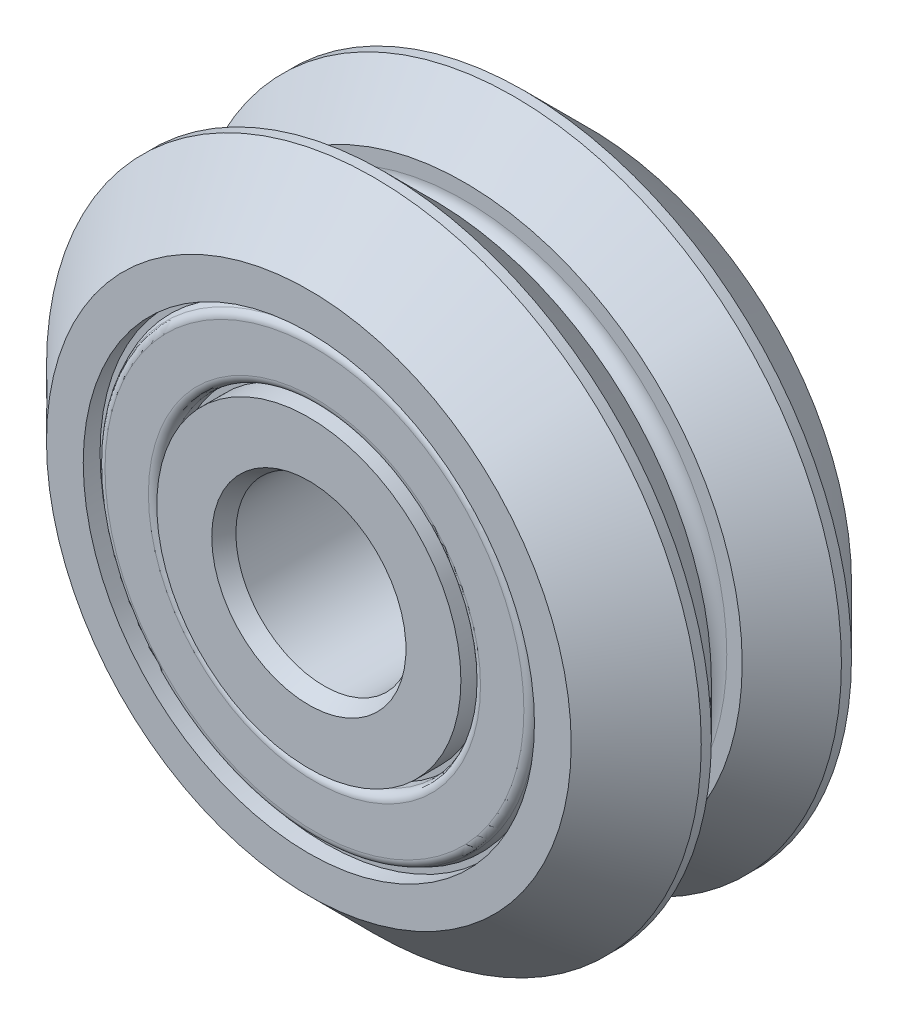
ISO-10303-21;
HEADER;
FILE_DESCRIPTION(('STEP AP214'),'2;1');
FILE_NAME('part.step','',(''),(''),'','','');
FILE_SCHEMA(('AUTOMOTIVE_DESIGN { 1 0 10303 214 1 1 1 1 }'));
ENDSEC;
DATA;
#1=APPLICATION_CONTEXT('core data for automotive mechanical design processes');
#2=APPLICATION_PROTOCOL_DEFINITION('international standard','automotive_design',2000,#1);
#3=PRODUCT_CONTEXT('',#1,'mechanical');
#4=PRODUCT('Part','Part','',(#3));
#5=PRODUCT_RELATED_PRODUCT_CATEGORY('part','',(#4));
#6=PRODUCT_DEFINITION_FORMATION('','',#4);
#7=PRODUCT_DEFINITION_CONTEXT('part definition',#1,'design');
#8=PRODUCT_DEFINITION('design','',#6,#7);
#9=PRODUCT_DEFINITION_SHAPE('','',#8);
#10=(LENGTH_UNIT() NAMED_UNIT(*) SI_UNIT(.MILLI.,.METRE.));
#11=(NAMED_UNIT(*) PLANE_ANGLE_UNIT() SI_UNIT($,.RADIAN.));
#12=(NAMED_UNIT(*) SI_UNIT($,.STERADIAN.) SOLID_ANGLE_UNIT());
#13=UNCERTAINTY_MEASURE_WITH_UNIT(LENGTH_MEASURE(1.E-05),#10,'distance_accuracy_value','');
#14=(GEOMETRIC_REPRESENTATION_CONTEXT(3) GLOBAL_UNCERTAINTY_ASSIGNED_CONTEXT((#13)) GLOBAL_UNIT_ASSIGNED_CONTEXT((#10,
#11,#12)) REPRESENTATION_CONTEXT('',''));
#15=CARTESIAN_POINT('',(0.,0.,0.));
#16=DIRECTION('',(0.,0.,1.));
#17=DIRECTION('',(1.,0.,0.));
#18=AXIS2_PLACEMENT_3D('',#15,#16,#17);
#19=CARTESIAN_POINT('',(0.,5.11118769230769,-2.60350000000001));
#20=DIRECTION('',(0.,0.,-1.));
#21=DIRECTION('',(1.,0.,0.));
#22=AXIS2_PLACEMENT_3D('',#19,#20,#21);
#23=PLANE('',#22);
#24=CARTESIAN_POINT('',(0.,0.,-2.60350000000001));
#25=DIRECTION('',(0.,0.,1.));
#26=DIRECTION('',(1.,0.,0.));
#27=AXIS2_PLACEMENT_3D('',#24,#25,#26);
#28=CIRCLE('',#27,5.11118769230769);
#29=CARTESIAN_POINT('',(5.11118769230769,0.,-2.60350000000001));
#30=VERTEX_POINT('',#29);
#31=EDGE_CURVE('E61',#30,#30,#28,.T.);
#32=ORIENTED_EDGE('',*,*,#31,.T.);
#33=EDGE_LOOP('',(#32));
#34=FACE_BOUND('',#33,.T.);
#35=CARTESIAN_POINT('',(0.,0.,-2.60350000000001));
#36=DIRECTION('',(0.,0.,1.));
#37=DIRECTION('',(1.,0.,0.));
#38=AXIS2_PLACEMENT_3D('',#35,#36,#37);
#39=CIRCLE('',#38,3.57148);
#40=CARTESIAN_POINT('',(3.57148,0.,-2.60350000000001));
#41=VERTEX_POINT('',#40);
#42=EDGE_CURVE('E70',#41,#41,#39,.T.);
#43=ORIENTED_EDGE('',*,*,#42,.F.);
#44=EDGE_LOOP('',(#43));
#45=FACE_BOUND('',#44,.T.);
#46=ADVANCED_FACE('F41',(#34,#45),#23,.F.);
#47=CARTESIAN_POINT('',(0.,0.,-3.175));
#48=DIRECTION('',(0.,0.,-1.));
#49=DIRECTION('',(1.,0.,0.));
#50=AXIS2_PLACEMENT_3D('',#47,#48,#49);
#51=CYLINDRICAL_SURFACE('',#50,5.11118769230769);
#52=CARTESIAN_POINT('',(0.,0.,-2.794));
#53=DIRECTION('',(0.,0.,1.));
#54=DIRECTION('',(1.,0.,0.));
#55=AXIS2_PLACEMENT_3D('',#52,#53,#54);
#56=CIRCLE('',#55,5.11118769230769);
#57=CARTESIAN_POINT('',(5.11118769230769,0.,-2.794));
#58=VERTEX_POINT('',#57);
#59=EDGE_CURVE('E64',#58,#58,#56,.T.);
#60=ORIENTED_EDGE('',*,*,#59,.T.);
#61=EDGE_LOOP('',(#60));
#62=FACE_BOUND('',#61,.T.);
#63=ORIENTED_EDGE('',*,*,#31,.F.);
#64=EDGE_LOOP('',(#63));
#65=FACE_BOUND('',#64,.T.);
#66=ADVANCED_FACE('F77',(#62,#65),#51,.T.);
#67=CARTESIAN_POINT('',(0.,5.11118769230769,-2.794));
#68=DIRECTION('',(0.,0.,1.));
#69=DIRECTION('',(-1.,0.,0.));
#70=AXIS2_PLACEMENT_3D('',#67,#68,#69);
#71=PLANE('',#70);
#72=CARTESIAN_POINT('',(0.,0.,-2.794));
#73=DIRECTION('',(0.,0.,1.));
#74=DIRECTION('',(1.,0.,0.));
#75=AXIS2_PLACEMENT_3D('',#72,#73,#74);
#76=CIRCLE('',#75,4.98418769230769);
#77=CARTESIAN_POINT('',(4.98418769230769,0.,-2.794));
#78=VERTEX_POINT('',#77);
#79=EDGE_CURVE('E67',#78,#78,#76,.T.);
#80=ORIENTED_EDGE('',*,*,#79,.T.);
#81=EDGE_LOOP('',(#80));
#82=FACE_BOUND('',#81,.T.);
#83=ORIENTED_EDGE('',*,*,#59,.F.);
#84=EDGE_LOOP('',(#83));
#85=FACE_BOUND('',#84,.T.);
#86=ADVANCED_FACE('F83',(#82,#85),#71,.F.);
#87=CARTESIAN_POINT('',(0.,0.,-2.794));
#88=DIRECTION('',(0.,0.,1.));
#89=DIRECTION('',(-1.,0.,0.));
#90=AXIS2_PLACEMENT_3D('',#87,#88,#89);
#91=CONICAL_SURFACE('',#90,4.98418769230769,0.436332312998612);
#92=CARTESIAN_POINT('',(0.,0.,-2.93800877886161));
#93=DIRECTION('',(0.,0.,1.));
#94=DIRECTION('',(1.,0.,0.));
#95=AXIS2_PLACEMENT_3D('',#92,#93,#94);
#96=CIRCLE('',#95,4.91703529588297);
#97=CARTESIAN_POINT('',(4.91703529588297,0.,-2.93800877886161));
#98=VERTEX_POINT('',#97);
#99=EDGE_CURVE('E48',#98,#98,#96,.F.);
#100=ORIENTED_EDGE('',*,*,#99,.F.);
#101=EDGE_LOOP('',(#100));
#102=FACE_BOUND('',#101,.T.);
#103=ORIENTED_EDGE('',*,*,#79,.F.);
#104=EDGE_LOOP('',(#103));
#105=FACE_BOUND('',#104,.T.);
#106=ADVANCED_FACE('F102',(#102,#105),#91,.T.);
#107=CARTESIAN_POINT('',(0.,4.86574554713631,-3.048));
#108=DIRECTION('',(0.,0.,1.));
#109=DIRECTION('',(-1.,0.,0.));
#110=AXIS2_PLACEMENT_3D('',#107,#108,#109);
#111=PLANE('',#110);
#112=CARTESIAN_POINT('',(0.,0.,-3.048));
#113=DIRECTION('',(0.,0.,-1.));
#114=DIRECTION('',(-1.,0.,0.));
#115=AXIS2_PLACEMENT_3D('',#112,#113,#114);
#116=CIRCLE('',#115,4.74438366245249);
#117=CARTESIAN_POINT('',(-4.74438366245249,0.,-3.048));
#118=VERTEX_POINT('',#117);
#119=EDGE_CURVE('E52',#118,#118,#116,.F.);
#120=ORIENTED_EDGE('',*,*,#119,.F.);
#121=EDGE_LOOP('',(#120));
#122=FACE_BOUND('',#121,.T.);
#123=CARTESIAN_POINT('',(0.,0.,-3.048));
#124=DIRECTION('',(0.,0.,-1.));
#125=DIRECTION('',(-1.,0.,0.));
#126=AXIS2_PLACEMENT_3D('',#123,#124,#125);
#127=CIRCLE('',#126,3.76198);
#128=CARTESIAN_POINT('',(-3.76198,0.,-3.048));
#129=VERTEX_POINT('',#128);
#130=EDGE_CURVE('E56',#129,#129,#127,.T.);
#131=ORIENTED_EDGE('',*,*,#130,.F.);
#132=EDGE_LOOP('',(#131));
#133=FACE_BOUND('',#132,.T.);
#134=ADVANCED_FACE('F94',(#122,#133),#111,.F.);
#135=CARTESIAN_POINT('',(0.,0.,-3.175));
#136=DIRECTION('',(0.,0.,-1.));
#137=DIRECTION('',(1.,0.,0.));
#138=AXIS2_PLACEMENT_3D('',#135,#136,#137);
#139=CYLINDRICAL_SURFACE('',#138,3.57148);
#140=CARTESIAN_POINT('',(0.,0.,-2.8575));
#141=DIRECTION('',(0.,0.,-1.));
#142=DIRECTION('',(-1.,0.,0.));
#143=AXIS2_PLACEMENT_3D('',#140,#141,#142);
#144=CIRCLE('',#143,3.57148);
#145=CARTESIAN_POINT('',(-3.57148,0.,-2.8575));
#146=VERTEX_POINT('',#145);
#147=EDGE_CURVE('E11',#146,#146,#144,.F.);
#148=ORIENTED_EDGE('',*,*,#147,.F.);
#149=EDGE_LOOP('',(#148));
#150=FACE_BOUND('',#149,.T.);
#151=ORIENTED_EDGE('',*,*,#42,.T.);
#152=EDGE_LOOP('',(#151));
#153=FACE_BOUND('',#152,.T.);
#154=ADVANCED_FACE('F74',(#150,#153),#139,.F.);
#155=CARTESIAN_POINT('',(0.,0.,-2.8575));
#156=DIRECTION('',(0.,0.,1.));
#157=DIRECTION('',(-1.,0.,0.));
#158=AXIS2_PLACEMENT_3D('',#155,#156,#157);
#159=TOROIDAL_SURFACE('',#158,4.74438366245249,0.1905);
#160=ORIENTED_EDGE('',*,*,#99,.T.);
#161=EDGE_LOOP('',(#160));
#162=FACE_BOUND('',#161,.T.);
#163=ORIENTED_EDGE('',*,*,#119,.T.);
#164=EDGE_LOOP('',(#163));
#165=FACE_BOUND('',#164,.T.);
#166=ADVANCED_FACE('F87',(#162,#165),#159,.T.);
#167=CARTESIAN_POINT('',(0.,0.,-2.8575));
#168=DIRECTION('',(0.,0.,1.));
#169=DIRECTION('',(-1.,0.,0.));
#170=AXIS2_PLACEMENT_3D('',#167,#168,#169);
#171=TOROIDAL_SURFACE('',#170,3.76198,0.1905);
#172=ORIENTED_EDGE('',*,*,#130,.T.);
#173=EDGE_LOOP('',(#172));
#174=FACE_BOUND('',#173,.T.);
#175=ORIENTED_EDGE('',*,*,#147,.T.);
#176=EDGE_LOOP('',(#175));
#177=FACE_BOUND('',#176,.T.);
#178=ADVANCED_FACE('F43',(#174,#177),#171,.T.);
#179=CLOSED_SHELL('',(#46,#66,#86,#106,#134,#154,#166,#178));
#180=MANIFOLD_SOLID_BREP('B2',#179);
#181=CARTESIAN_POINT('',(0.,0.,0.));
#182=DIRECTION('',(0.,0.,1.));
#183=DIRECTION('',(1.,0.,0.));
#184=AXIS2_PLACEMENT_3D('',#181,#182,#183);
#185=TOROIDAL_SURFACE('',#184,5.9436,0.349250000000003);
#186=CARTESIAN_POINT('',(0.,0.,0.349249999999998));
#187=DIRECTION('',(0.,0.,1.));
#188=DIRECTION('',(1.,0.,0.));
#189=AXIS2_PLACEMENT_3D('',#186,#187,#188);
#190=CIRCLE('',#189,5.9436);
#191=CARTESIAN_POINT('',(5.9436,0.,0.349249999999998));
#192=VERTEX_POINT('',#191);
#193=EDGE_CURVE('E40',#192,#192,#190,.T.);
#194=ORIENTED_EDGE('',*,*,#193,.F.);
#195=EDGE_LOOP('',(#194));
#196=FACE_BOUND('',#195,.T.);
#197=CARTESIAN_POINT('',(0.,0.,-0.349249999999998));
#198=DIRECTION('',(0.,0.,1.));
#199=DIRECTION('',(1.,0.,0.));
#200=AXIS2_PLACEMENT_3D('',#197,#198,#199);
#201=CIRCLE('',#200,5.9436);
#202=CARTESIAN_POINT('',(5.9436,0.,-0.349249999999998));
#203=VERTEX_POINT('',#202);
#204=EDGE_CURVE('E228',#203,#203,#201,.T.);
#205=ORIENTED_EDGE('',*,*,#204,.T.);
#206=EDGE_LOOP('',(#205));
#207=FACE_BOUND('',#206,.T.);
#208=ADVANCED_FACE('F197',(#196,#207),#185,.F.);
#209=CARTESIAN_POINT('',(0.,5.9436,0.349249999999998));
#210=DIRECTION('',(0.,0.,1.));
#211=DIRECTION('',(1.,0.,0.));
#212=AXIS2_PLACEMENT_3D('',#209,#210,#211);
#213=PLANE('',#212);
#214=CARTESIAN_POINT('',(0.,0.,0.349249999999998));
#215=DIRECTION('',(0.,0.,1.));
#216=DIRECTION('',(1.,0.,0.));
#217=AXIS2_PLACEMENT_3D('',#214,#215,#216);
#218=CIRCLE('',#217,6.29285000000001);
#219=CARTESIAN_POINT('',(6.29285000000001,0.,0.349249999999998));
#220=VERTEX_POINT('',#219);
#221=EDGE_CURVE('E203',#220,#220,#218,.T.);
#222=ORIENTED_EDGE('',*,*,#221,.F.);
#223=EDGE_LOOP('',(#222));
#224=FACE_BOUND('',#223,.T.);
#225=ORIENTED_EDGE('',*,*,#193,.T.);
#226=EDGE_LOOP('',(#225));
#227=FACE_BOUND('',#226,.T.);
#228=ADVANCED_FACE('F273',(#224,#227),#213,.F.);
#229=CARTESIAN_POINT('',(0.,0.,0.349249999999998));
#230=DIRECTION('',(0.,0.,1.));
#231=DIRECTION('',(1.,0.,0.));
#232=AXIS2_PLACEMENT_3D('',#229,#230,#231);
#233=CONICAL_SURFACE('',#232,6.29285000000001,0.785398163397448);
#234=CARTESIAN_POINT('',(0.,0.,1.47319999999999));
#235=DIRECTION('',(0.,0.,1.));
#236=DIRECTION('',(1.,0.,0.));
#237=AXIS2_PLACEMENT_3D('',#234,#235,#236);
#238=CIRCLE('',#237,7.4168);
#239=CARTESIAN_POINT('',(7.4168,0.,1.47319999999999));
#240=VERTEX_POINT('',#239);
#241=EDGE_CURVE('E207',#240,#240,#238,.T.);
#242=ORIENTED_EDGE('',*,*,#241,.F.);
#243=EDGE_LOOP('',(#242));
#244=FACE_BOUND('',#243,.T.);
#245=ORIENTED_EDGE('',*,*,#221,.T.);
#246=EDGE_LOOP('',(#245));
#247=FACE_BOUND('',#246,.T.);
#248=ADVANCED_FACE('F278',(#244,#247),#233,.T.);
#249=CARTESIAN_POINT('',(0.,0.,3.175));
#250=DIRECTION('',(0.,0.,1.));
#251=DIRECTION('',(1.,0.,0.));
#252=AXIS2_PLACEMENT_3D('',#249,#250,#251);
#253=CYLINDRICAL_SURFACE('',#252,7.4168);
#254=CARTESIAN_POINT('',(0.,0.,1.70180000000001));
#255=DIRECTION('',(0.,0.,1.));
#256=DIRECTION('',(1.,0.,0.));
#257=AXIS2_PLACEMENT_3D('',#254,#255,#256);
#258=CIRCLE('',#257,7.4168);
#259=CARTESIAN_POINT('',(7.4168,0.,1.70180000000001));
#260=VERTEX_POINT('',#259);
#261=EDGE_CURVE('E211',#260,#260,#258,.T.);
#262=ORIENTED_EDGE('',*,*,#261,.F.);
#263=EDGE_LOOP('',(#262));
#264=FACE_BOUND('',#263,.T.);
#265=ORIENTED_EDGE('',*,*,#241,.T.);
#266=EDGE_LOOP('',(#265));
#267=FACE_BOUND('',#266,.T.);
#268=ADVANCED_FACE('F286',(#264,#267),#253,.T.);
#269=CARTESIAN_POINT('',(0.,0.,1.70180000000001));
#270=DIRECTION('',(0.,0.,-1.));
#271=DIRECTION('',(-1.,0.,0.));
#272=AXIS2_PLACEMENT_3D('',#269,#270,#271);
#273=CONICAL_SURFACE('',#272,7.4168,0.785398163397451);
#274=CARTESIAN_POINT('',(0.,0.,3.175));
#275=DIRECTION('',(0.,0.,1.));
#276=DIRECTION('',(1.,0.,0.));
#277=AXIS2_PLACEMENT_3D('',#274,#275,#276);
#278=CIRCLE('',#277,5.9436);
#279=CARTESIAN_POINT('',(5.9436,0.,3.175));
#280=VERTEX_POINT('',#279);
#281=EDGE_CURVE('E216',#280,#280,#278,.T.);
#282=ORIENTED_EDGE('',*,*,#281,.F.);
#283=EDGE_LOOP('',(#282));
#284=FACE_BOUND('',#283,.T.);
#285=ORIENTED_EDGE('',*,*,#261,.T.);
#286=EDGE_LOOP('',(#285));
#287=FACE_BOUND('',#286,.T.);
#288=ADVANCED_FACE('F292',(#284,#287),#273,.T.);
#289=CARTESIAN_POINT('',(0.,5.11118769230769,3.175));
#290=DIRECTION('',(0.,0.,-1.));
#291=DIRECTION('',(-1.,0.,0.));
#292=AXIS2_PLACEMENT_3D('',#289,#290,#291);
#293=PLANE('',#292);
#294=CARTESIAN_POINT('',(0.,0.,3.175));
#295=DIRECTION('',(0.,0.,1.));
#296=DIRECTION('',(1.,0.,0.));
#297=AXIS2_PLACEMENT_3D('',#294,#295,#296);
#298=CIRCLE('',#297,5.11118769230769);
#299=CARTESIAN_POINT('',(5.11118769230769,0.,3.175));
#300=VERTEX_POINT('',#299);
#301=EDGE_CURVE('E219',#300,#300,#298,.T.);
#302=ORIENTED_EDGE('',*,*,#301,.F.);
#303=EDGE_LOOP('',(#302));
#304=FACE_BOUND('',#303,.T.);
#305=ORIENTED_EDGE('',*,*,#281,.T.);
#306=EDGE_LOOP('',(#305));
#307=FACE_BOUND('',#306,.T.);
#308=ADVANCED_FACE('F296',(#304,#307),#293,.F.);
#309=CARTESIAN_POINT('',(0.,0.,3.175));
#310=DIRECTION('',(0.,0.,1.));
#311=DIRECTION('',(1.,0.,0.));
#312=AXIS2_PLACEMENT_3D('',#309,#310,#311);
#313=CYLINDRICAL_SURFACE('',#312,5.11118769230769);
#314=CARTESIAN_POINT('',(0.,0.,2.60350000000001));
#315=DIRECTION('',(0.,0.,1.));
#316=DIRECTION('',(1.,0.,0.));
#317=AXIS2_PLACEMENT_3D('',#314,#315,#316);
#318=CIRCLE('',#317,5.11118769230769);
#319=CARTESIAN_POINT('',(5.11118769230769,0.,2.60350000000001));
#320=VERTEX_POINT('',#319);
#321=EDGE_CURVE('E222',#320,#320,#318,.T.);
#322=ORIENTED_EDGE('',*,*,#321,.F.);
#323=EDGE_LOOP('',(#322));
#324=FACE_BOUND('',#323,.T.);
#325=ORIENTED_EDGE('',*,*,#301,.T.);
#326=EDGE_LOOP('',(#325));
#327=FACE_BOUND('',#326,.T.);
#328=ADVANCED_FACE('F269',(#324,#327),#313,.F.);
#329=CARTESIAN_POINT('',(0.,5.11118769230769,2.60350000000001));
#330=DIRECTION('',(0.,0.,-1.));
#331=DIRECTION('',(-1.,0.,0.));
#332=AXIS2_PLACEMENT_3D('',#329,#330,#331);
#333=PLANE('',#332);
#334=CARTESIAN_POINT('',(0.,0.,2.60350000000001));
#335=DIRECTION('',(0.,0.,1.));
#336=DIRECTION('',(1.,0.,0.));
#337=AXIS2_PLACEMENT_3D('',#334,#335,#336);
#338=CIRCLE('',#337,3.44448);
#339=CARTESIAN_POINT('',(3.44448,0.,2.60350000000001));
#340=VERTEX_POINT('',#339);
#341=EDGE_CURVE('E225',#340,#340,#338,.T.);
#342=ORIENTED_EDGE('',*,*,#341,.F.);
#343=EDGE_LOOP('',(#342));
#344=FACE_BOUND('',#343,.T.);
#345=ORIENTED_EDGE('',*,*,#321,.T.);
#346=EDGE_LOOP('',(#345));
#347=FACE_BOUND('',#346,.T.);
#348=ADVANCED_FACE('F259',(#344,#347),#333,.F.);
#349=CARTESIAN_POINT('',(0.,0.,3.175));
#350=DIRECTION('',(0.,0.,1.));
#351=DIRECTION('',(1.,0.,0.));
#352=AXIS2_PLACEMENT_3D('',#349,#350,#351);
#353=CYLINDRICAL_SURFACE('',#352,3.44448);
#354=ORIENTED_EDGE('',*,*,#341,.T.);
#355=EDGE_LOOP('',(#354));
#356=FACE_BOUND('',#355,.T.);
#357=CARTESIAN_POINT('',(0.,0.,-2.60350000000001));
#358=DIRECTION('',(0.,0.,1.));
#359=DIRECTION('',(1.,0.,0.));
#360=AXIS2_PLACEMENT_3D('',#357,#358,#359);
#361=CIRCLE('',#360,3.44448);
#362=CARTESIAN_POINT('',(3.44448,0.,-2.60350000000001));
#363=VERTEX_POINT('',#362);
#364=EDGE_CURVE('E249',#363,#363,#361,.T.);
#365=ORIENTED_EDGE('',*,*,#364,.F.);
#366=EDGE_LOOP('',(#365));
#367=FACE_BOUND('',#366,.T.);
#368=ADVANCED_FACE('F256',(#356,#367),#353,.F.);
#369=CARTESIAN_POINT('',(0.,5.9436,-0.349249999999998));
#370=DIRECTION('',(0.,0.,-1.));
#371=DIRECTION('',(1.,0.,0.));
#372=AXIS2_PLACEMENT_3D('',#369,#370,#371);
#373=PLANE('',#372);
#374=CARTESIAN_POINT('',(0.,0.,-0.349249999999998));
#375=DIRECTION('',(0.,0.,1.));
#376=DIRECTION('',(1.,0.,0.));
#377=AXIS2_PLACEMENT_3D('',#374,#375,#376);
#378=CIRCLE('',#377,6.29285000000001);
#379=CARTESIAN_POINT('',(6.29285000000001,0.,-0.349249999999998));
#380=VERTEX_POINT('',#379);
#381=EDGE_CURVE('E231',#380,#380,#378,.T.);
#382=ORIENTED_EDGE('',*,*,#381,.T.);
#383=EDGE_LOOP('',(#382));
#384=FACE_BOUND('',#383,.T.);
#385=ORIENTED_EDGE('',*,*,#204,.F.);
#386=EDGE_LOOP('',(#385));
#387=FACE_BOUND('',#386,.T.);
#388=ADVANCED_FACE('F258',(#384,#387),#373,.F.);
#389=CARTESIAN_POINT('',(0.,0.,-0.349249999999998));
#390=DIRECTION('',(0.,0.,-1.));
#391=DIRECTION('',(1.,0.,0.));
#392=AXIS2_PLACEMENT_3D('',#389,#390,#391);
#393=CONICAL_SURFACE('',#392,6.29285000000001,0.785398163397448);
#394=CARTESIAN_POINT('',(0.,0.,-1.47319999999999));
#395=DIRECTION('',(0.,0.,1.));
#396=DIRECTION('',(1.,0.,0.));
#397=AXIS2_PLACEMENT_3D('',#394,#395,#396);
#398=CIRCLE('',#397,7.4168);
#399=CARTESIAN_POINT('',(7.4168,0.,-1.47319999999999));
#400=VERTEX_POINT('',#399);
#401=EDGE_CURVE('E234',#400,#400,#398,.T.);
#402=ORIENTED_EDGE('',*,*,#401,.T.);
#403=EDGE_LOOP('',(#402));
#404=FACE_BOUND('',#403,.T.);
#405=ORIENTED_EDGE('',*,*,#381,.F.);
#406=EDGE_LOOP('',(#405));
#407=FACE_BOUND('',#406,.T.);
#408=ADVANCED_FACE('F266',(#404,#407),#393,.T.);
#409=CARTESIAN_POINT('',(0.,0.,-3.175));
#410=DIRECTION('',(0.,0.,-1.));
#411=DIRECTION('',(1.,0.,0.));
#412=AXIS2_PLACEMENT_3D('',#409,#410,#411);
#413=CYLINDRICAL_SURFACE('',#412,7.4168);
#414=CARTESIAN_POINT('',(0.,0.,-1.70180000000001));
#415=DIRECTION('',(0.,0.,1.));
#416=DIRECTION('',(1.,0.,0.));
#417=AXIS2_PLACEMENT_3D('',#414,#415,#416);
#418=CIRCLE('',#417,7.4168);
#419=CARTESIAN_POINT('',(7.4168,0.,-1.70180000000001));
#420=VERTEX_POINT('',#419);
#421=EDGE_CURVE('E237',#420,#420,#418,.T.);
#422=ORIENTED_EDGE('',*,*,#421,.T.);
#423=EDGE_LOOP('',(#422));
#424=FACE_BOUND('',#423,.T.);
#425=ORIENTED_EDGE('',*,*,#401,.F.);
#426=EDGE_LOOP('',(#425));
#427=FACE_BOUND('',#426,.T.);
#428=ADVANCED_FACE('F349',(#424,#427),#413,.T.);
#429=CARTESIAN_POINT('',(0.,0.,-1.70180000000001));
#430=DIRECTION('',(0.,0.,1.));
#431=DIRECTION('',(-1.,0.,0.));
#432=AXIS2_PLACEMENT_3D('',#429,#430,#431);
#433=CONICAL_SURFACE('',#432,7.4168,0.785398163397451);
#434=CARTESIAN_POINT('',(0.,0.,-3.175));
#435=DIRECTION('',(0.,0.,1.));
#436=DIRECTION('',(1.,0.,0.));
#437=AXIS2_PLACEMENT_3D('',#434,#435,#436);
#438=CIRCLE('',#437,5.9436);
#439=CARTESIAN_POINT('',(5.9436,0.,-3.175));
#440=VERTEX_POINT('',#439);
#441=EDGE_CURVE('E240',#440,#440,#438,.T.);
#442=ORIENTED_EDGE('',*,*,#441,.T.);
#443=EDGE_LOOP('',(#442));
#444=FACE_BOUND('',#443,.T.);
#445=ORIENTED_EDGE('',*,*,#421,.F.);
#446=EDGE_LOOP('',(#445));
#447=FACE_BOUND('',#446,.T.);
#448=ADVANCED_FACE('F358',(#444,#447),#433,.T.);
#449=CARTESIAN_POINT('',(0.,5.11118769230769,-3.175));
#450=DIRECTION('',(0.,0.,1.));
#451=DIRECTION('',(-1.,0.,0.));
#452=AXIS2_PLACEMENT_3D('',#449,#450,#451);
#453=PLANE('',#452);
#454=CARTESIAN_POINT('',(0.,0.,-3.175));
#455=DIRECTION('',(0.,0.,1.));
#456=DIRECTION('',(1.,0.,0.));
#457=AXIS2_PLACEMENT_3D('',#454,#455,#456);
#458=CIRCLE('',#457,5.11118769230769);
#459=CARTESIAN_POINT('',(5.11118769230769,0.,-3.175));
#460=VERTEX_POINT('',#459);
#461=EDGE_CURVE('E243',#460,#460,#458,.T.);
#462=ORIENTED_EDGE('',*,*,#461,.T.);
#463=EDGE_LOOP('',(#462));
#464=FACE_BOUND('',#463,.T.);
#465=ORIENTED_EDGE('',*,*,#441,.F.);
#466=EDGE_LOOP('',(#465));
#467=FACE_BOUND('',#466,.T.);
#468=ADVANCED_FACE('F367',(#464,#467),#453,.F.);
#469=CARTESIAN_POINT('',(0.,0.,-3.175));
#470=DIRECTION('',(0.,0.,-1.));
#471=DIRECTION('',(1.,0.,0.));
#472=AXIS2_PLACEMENT_3D('',#469,#470,#471);
#473=CYLINDRICAL_SURFACE('',#472,5.11118769230769);
#474=CARTESIAN_POINT('',(0.,0.,-2.60350000000001));
#475=DIRECTION('',(0.,0.,1.));
#476=DIRECTION('',(1.,0.,0.));
#477=AXIS2_PLACEMENT_3D('',#474,#475,#476);
#478=CIRCLE('',#477,5.11118769230769);
#479=CARTESIAN_POINT('',(5.11118769230769,0.,-2.60350000000001));
#480=VERTEX_POINT('',#479);
#481=EDGE_CURVE('E246',#480,#480,#478,.T.);
#482=ORIENTED_EDGE('',*,*,#481,.T.);
#483=EDGE_LOOP('',(#482));
#484=FACE_BOUND('',#483,.T.);
#485=ORIENTED_EDGE('',*,*,#461,.F.);
#486=EDGE_LOOP('',(#485));
#487=FACE_BOUND('',#486,.T.);
#488=ADVANCED_FACE('F376',(#484,#487),#473,.F.);
#489=CARTESIAN_POINT('',(0.,5.11118769230769,-2.60350000000001));
#490=DIRECTION('',(0.,0.,1.));
#491=DIRECTION('',(-1.,0.,0.));
#492=AXIS2_PLACEMENT_3D('',#489,#490,#491);
#493=PLANE('',#492);
#494=ORIENTED_EDGE('',*,*,#364,.T.);
#495=EDGE_LOOP('',(#494));
#496=FACE_BOUND('',#495,.T.);
#497=ORIENTED_EDGE('',*,*,#481,.F.);
#498=EDGE_LOOP('',(#497));
#499=FACE_BOUND('',#498,.T.);
#500=ADVANCED_FACE('F253',(#496,#499),#493,.F.);
#501=CLOSED_SHELL('',(#208,#228,#248,#268,#288,#308,#328,#348,#368,#388,#408,#428,#448,#468,
#488,#500));
#502=MANIFOLD_SOLID_BREP('B6',#501);
#503=CARTESIAN_POINT('',(0.,0.,3.175));
#504=DIRECTION('',(0.,0.,1.));
#505=DIRECTION('',(1.,0.,0.));
#506=AXIS2_PLACEMENT_3D('',#503,#504,#505);
#507=CYLINDRICAL_SURFACE('',#506,2.);
#508=CARTESIAN_POINT('',(0.,0.,2.82858983848623));
#509=DIRECTION('',(0.,0.,-1.));
#510=DIRECTION('',(-1.,0.,0.));
#511=AXIS2_PLACEMENT_3D('',#508,#509,#510);
#512=CIRCLE('',#511,2.);
#513=CARTESIAN_POINT('',(-2.,0.,2.82858983848623));
#514=VERTEX_POINT('',#513);
#515=EDGE_CURVE('E462',#514,#514,#512,.F.);
#516=ORIENTED_EDGE('',*,*,#515,.T.);
#517=EDGE_LOOP('',(#516));
#518=FACE_BOUND('',#517,.T.);
#519=CARTESIAN_POINT('',(0.,0.,-2.82858983848623));
#520=DIRECTION('',(0.,0.,-1.));
#521=DIRECTION('',(-1.,0.,0.));
#522=AXIS2_PLACEMENT_3D('',#519,#520,#521);
#523=CIRCLE('',#522,2.);
#524=CARTESIAN_POINT('',(-2.,0.,-2.82858983848623));
#525=VERTEX_POINT('',#524);
#526=EDGE_CURVE('E475',#525,#525,#523,.F.);
#527=ORIENTED_EDGE('',*,*,#526,.F.);
#528=EDGE_LOOP('',(#527));
#529=FACE_BOUND('',#528,.T.);
#530=ADVANCED_FACE('F455',(#518,#529),#507,.F.);
#531=CARTESIAN_POINT('',(0.,2.,3.175));
#532=DIRECTION('',(0.,0.,-1.));
#533=DIRECTION('',(-1.,0.,0.));
#534=AXIS2_PLACEMENT_3D('',#531,#532,#533);
#535=PLANE('',#534);
#536=CARTESIAN_POINT('',(0.,0.,3.175));
#537=DIRECTION('',(0.,0.,-1.));
#538=DIRECTION('',(-1.,0.,0.));
#539=AXIS2_PLACEMENT_3D('',#536,#537,#538);
#540=CIRCLE('',#539,2.2);
#541=CARTESIAN_POINT('',(-2.2,0.,3.175));
#542=VERTEX_POINT('',#541);
#543=EDGE_CURVE('E196',#542,#542,#540,.T.);
#544=ORIENTED_EDGE('',*,*,#543,.T.);
#545=EDGE_LOOP('',(#544));
#546=FACE_BOUND('',#545,.T.);
#547=CARTESIAN_POINT('',(0.,0.,3.175));
#548=DIRECTION('',(0.,0.,1.));
#549=DIRECTION('',(1.,0.,0.));
#550=AXIS2_PLACEMENT_3D('',#547,#548,#549);
#551=CIRCLE('',#550,3.44448);
#552=CARTESIAN_POINT('',(3.44448,0.,3.175));
#553=VERTEX_POINT('',#552);
#554=EDGE_CURVE('E466',#553,#553,#551,.T.);
#555=ORIENTED_EDGE('',*,*,#554,.T.);
#556=EDGE_LOOP('',(#555));
#557=FACE_BOUND('',#556,.T.);
#558=ADVANCED_FACE('F498',(#546,#557),#535,.F.);
#559=CARTESIAN_POINT('',(0.,0.,3.175));
#560=DIRECTION('',(0.,0.,1.));
#561=DIRECTION('',(1.,0.,0.));
#562=AXIS2_PLACEMENT_3D('',#559,#560,#561);
#563=CYLINDRICAL_SURFACE('',#562,3.44448);
#564=ORIENTED_EDGE('',*,*,#554,.F.);
#565=EDGE_LOOP('',(#564));
#566=FACE_BOUND('',#565,.T.);
#567=CARTESIAN_POINT('',(0.,0.,-3.175));
#568=DIRECTION('',(0.,0.,1.));
#569=DIRECTION('',(1.,0.,0.));
#570=AXIS2_PLACEMENT_3D('',#567,#568,#569);
#571=CIRCLE('',#570,3.44448);
#572=CARTESIAN_POINT('',(3.44448,0.,-3.175));
#573=VERTEX_POINT('',#572);
#574=EDGE_CURVE('E478',#573,#573,#571,.T.);
#575=ORIENTED_EDGE('',*,*,#574,.T.);
#576=EDGE_LOOP('',(#575));
#577=FACE_BOUND('',#576,.T.);
#578=ADVANCED_FACE('F482',(#566,#577),#563,.T.);
#579=CARTESIAN_POINT('',(0.,0.,2.82858983848623));
#580=DIRECTION('',(0.,0.,1.));
#581=DIRECTION('',(1.,0.,0.));
#582=AXIS2_PLACEMENT_3D('',#579,#580,#581);
#583=CONICAL_SURFACE('',#582,2.,0.523598775598301);
#584=ORIENTED_EDGE('',*,*,#543,.F.);
#585=EDGE_LOOP('',(#584));
#586=FACE_BOUND('',#585,.T.);
#587=ORIENTED_EDGE('',*,*,#515,.F.);
#588=EDGE_LOOP('',(#587));
#589=FACE_BOUND('',#588,.T.);
#590=ADVANCED_FACE('F457',(#586,#589),#583,.F.);
#591=CARTESIAN_POINT('',(0.,2.,-3.175));
#592=DIRECTION('',(0.,0.,1.));
#593=DIRECTION('',(-1.,0.,0.));
#594=AXIS2_PLACEMENT_3D('',#591,#592,#593);
#595=PLANE('',#594);
#596=CARTESIAN_POINT('',(0.,0.,-3.175));
#597=DIRECTION('',(0.,0.,-1.));
#598=DIRECTION('',(-1.,0.,0.));
#599=AXIS2_PLACEMENT_3D('',#596,#597,#598);
#600=CIRCLE('',#599,2.2);
#601=CARTESIAN_POINT('',(-2.2,0.,-3.175));
#602=VERTEX_POINT('',#601);
#603=EDGE_CURVE('E470',#602,#602,#600,.T.);
#604=ORIENTED_EDGE('',*,*,#603,.F.);
#605=EDGE_LOOP('',(#604));
#606=FACE_BOUND('',#605,.T.);
#607=ORIENTED_EDGE('',*,*,#574,.F.);
#608=EDGE_LOOP('',(#607));
#609=FACE_BOUND('',#608,.T.);
#610=ADVANCED_FACE('F484',(#606,#609),#595,.F.);
#611=CARTESIAN_POINT('',(0.,0.,-2.82858983848623));
#612=DIRECTION('',(0.,0.,-1.));
#613=DIRECTION('',(1.,0.,0.));
#614=AXIS2_PLACEMENT_3D('',#611,#612,#613);
#615=CONICAL_SURFACE('',#614,2.,0.523598775598301);
#616=ORIENTED_EDGE('',*,*,#603,.T.);
#617=EDGE_LOOP('',(#616));
#618=FACE_BOUND('',#617,.T.);
#619=ORIENTED_EDGE('',*,*,#526,.T.);
#620=EDGE_LOOP('',(#619));
#621=FACE_BOUND('',#620,.T.);
#622=ADVANCED_FACE('F486',(#618,#621),#615,.F.);
#623=CLOSED_SHELL('',(#530,#558,#578,#590,#610,#622));
#624=MANIFOLD_SOLID_BREP('B35',#623);
#625=CARTESIAN_POINT('',(0.,5.11118769230769,2.60350000000001));
#626=DIRECTION('',(0.,0.,1.));
#627=DIRECTION('',(1.,0.,0.));
#628=AXIS2_PLACEMENT_3D('',#625,#626,#627);
#629=PLANE('',#628);
#630=CARTESIAN_POINT('',(0.,0.,2.60350000000001));
#631=DIRECTION('',(0.,0.,1.));
#632=DIRECTION('',(1.,0.,0.));
#633=AXIS2_PLACEMENT_3D('',#630,#631,#632);
#634=CIRCLE('',#633,5.11118769230769);
#635=CARTESIAN_POINT('',(5.11118769230769,0.,2.60350000000001));
#636=VERTEX_POINT('',#635);
#637=EDGE_CURVE('E576',#636,#636,#634,.T.);
#638=ORIENTED_EDGE('',*,*,#637,.F.);
#639=EDGE_LOOP('',(#638));
#640=FACE_BOUND('',#639,.T.);
#641=CARTESIAN_POINT('',(0.,0.,2.60350000000001));
#642=DIRECTION('',(0.,0.,1.));
#643=DIRECTION('',(1.,0.,0.));
#644=AXIS2_PLACEMENT_3D('',#641,#642,#643);
#645=CIRCLE('',#644,3.57148);
#646=CARTESIAN_POINT('',(3.57148,0.,2.60350000000001));
#647=VERTEX_POINT('',#646);
#648=EDGE_CURVE('E585',#647,#647,#645,.T.);
#649=ORIENTED_EDGE('',*,*,#648,.T.);
#650=EDGE_LOOP('',(#649));
#651=FACE_BOUND('',#650,.T.);
#652=ADVANCED_FACE('F556',(#640,#651),#629,.F.);
#653=CARTESIAN_POINT('',(0.,0.,3.175));
#654=DIRECTION('',(0.,0.,1.));
#655=DIRECTION('',(1.,0.,0.));
#656=AXIS2_PLACEMENT_3D('',#653,#654,#655);
#657=CYLINDRICAL_SURFACE('',#656,5.11118769230769);
#658=CARTESIAN_POINT('',(0.,0.,2.794));
#659=DIRECTION('',(0.,0.,1.));
#660=DIRECTION('',(1.,0.,0.));
#661=AXIS2_PLACEMENT_3D('',#658,#659,#660);
#662=CIRCLE('',#661,5.11118769230769);
#663=CARTESIAN_POINT('',(5.11118769230769,0.,2.794));
#664=VERTEX_POINT('',#663);
#665=EDGE_CURVE('E579',#664,#664,#662,.T.);
#666=ORIENTED_EDGE('',*,*,#665,.F.);
#667=EDGE_LOOP('',(#666));
#668=FACE_BOUND('',#667,.T.);
#669=ORIENTED_EDGE('',*,*,#637,.T.);
#670=EDGE_LOOP('',(#669));
#671=FACE_BOUND('',#670,.T.);
#672=ADVANCED_FACE('F604',(#668,#671),#657,.T.);
#673=CARTESIAN_POINT('',(0.,5.11118769230769,2.794));
#674=DIRECTION('',(0.,0.,-1.));
#675=DIRECTION('',(-1.,0.,0.));
#676=AXIS2_PLACEMENT_3D('',#673,#674,#675);
#677=PLANE('',#676);
#678=CARTESIAN_POINT('',(0.,0.,2.794));
#679=DIRECTION('',(0.,0.,1.));
#680=DIRECTION('',(1.,0.,0.));
#681=AXIS2_PLACEMENT_3D('',#678,#679,#680);
#682=CIRCLE('',#681,4.98418769230769);
#683=CARTESIAN_POINT('',(4.98418769230769,0.,2.794));
#684=VERTEX_POINT('',#683);
#685=EDGE_CURVE('E582',#684,#684,#682,.T.);
#686=ORIENTED_EDGE('',*,*,#685,.F.);
#687=EDGE_LOOP('',(#686));
#688=FACE_BOUND('',#687,.T.);
#689=ORIENTED_EDGE('',*,*,#665,.T.);
#690=EDGE_LOOP('',(#689));
#691=FACE_BOUND('',#690,.T.);
#692=ADVANCED_FACE('F610',(#688,#691),#677,.F.);
#693=CARTESIAN_POINT('',(0.,0.,2.794));
#694=DIRECTION('',(0.,0.,-1.));
#695=DIRECTION('',(-1.,0.,0.));
#696=AXIS2_PLACEMENT_3D('',#693,#694,#695);
#697=CONICAL_SURFACE('',#696,4.98418769230769,0.436332312998612);
#698=CARTESIAN_POINT('',(0.,0.,2.93800877886161));
#699=DIRECTION('',(0.,0.,1.));
#700=DIRECTION('',(1.,0.,0.));
#701=AXIS2_PLACEMENT_3D('',#698,#699,#700);
#702=CIRCLE('',#701,4.91703529588297);
#703=CARTESIAN_POINT('',(4.91703529588297,0.,2.93800877886161));
#704=VERTEX_POINT('',#703);
#705=EDGE_CURVE('E563',#704,#704,#702,.F.);
#706=ORIENTED_EDGE('',*,*,#705,.T.);
#707=EDGE_LOOP('',(#706));
#708=FACE_BOUND('',#707,.T.);
#709=ORIENTED_EDGE('',*,*,#685,.T.);
#710=EDGE_LOOP('',(#709));
#711=FACE_BOUND('',#710,.T.);
#712=ADVANCED_FACE('F600',(#708,#711),#697,.T.);
#713=CARTESIAN_POINT('',(0.,4.86574554713631,3.048));
#714=DIRECTION('',(0.,0.,-1.));
#715=DIRECTION('',(-1.,0.,0.));
#716=AXIS2_PLACEMENT_3D('',#713,#714,#715);
#717=PLANE('',#716);
#718=CARTESIAN_POINT('',(0.,0.,3.048));
#719=DIRECTION('',(0.,0.,-1.));
#720=DIRECTION('',(-1.,0.,0.));
#721=AXIS2_PLACEMENT_3D('',#718,#719,#720);
#722=CIRCLE('',#721,4.74438366245249);
#723=CARTESIAN_POINT('',(-4.74438366245249,0.,3.048));
#724=VERTEX_POINT('',#723);
#725=EDGE_CURVE('E567',#724,#724,#722,.F.);
#726=ORIENTED_EDGE('',*,*,#725,.T.);
#727=EDGE_LOOP('',(#726));
#728=FACE_BOUND('',#727,.T.);
#729=CARTESIAN_POINT('',(0.,0.,3.048));
#730=DIRECTION('',(0.,0.,-1.));
#731=DIRECTION('',(-1.,0.,0.));
#732=AXIS2_PLACEMENT_3D('',#729,#730,#731);
#733=CIRCLE('',#732,3.76198);
#734=CARTESIAN_POINT('',(-3.76198,0.,3.048));
#735=VERTEX_POINT('',#734);
#736=EDGE_CURVE('E571',#735,#735,#733,.T.);
#737=ORIENTED_EDGE('',*,*,#736,.T.);
#738=EDGE_LOOP('',(#737));
#739=FACE_BOUND('',#738,.T.);
#740=ADVANCED_FACE('F593',(#728,#739),#717,.F.);
#741=CARTESIAN_POINT('',(0.,0.,3.175));
#742=DIRECTION('',(0.,0.,1.));
#743=DIRECTION('',(1.,0.,0.));
#744=AXIS2_PLACEMENT_3D('',#741,#742,#743);
#745=CYLINDRICAL_SURFACE('',#744,3.57148);
#746=CARTESIAN_POINT('',(0.,0.,2.8575));
#747=DIRECTION('',(0.,0.,-1.));
#748=DIRECTION('',(-1.,0.,0.));
#749=AXIS2_PLACEMENT_3D('',#746,#747,#748);
#750=CIRCLE('',#749,3.57148);
#751=CARTESIAN_POINT('',(-3.57148,0.,2.8575));
#752=VERTEX_POINT('',#751);
#753=EDGE_CURVE('E454',#752,#752,#750,.F.);
#754=ORIENTED_EDGE('',*,*,#753,.T.);
#755=EDGE_LOOP('',(#754));
#756=FACE_BOUND('',#755,.T.);
#757=ORIENTED_EDGE('',*,*,#648,.F.);
#758=EDGE_LOOP('',(#757));
#759=FACE_BOUND('',#758,.T.);
#760=ADVANCED_FACE('F590',(#756,#759),#745,.F.);
#761=CARTESIAN_POINT('',(0.,0.,2.8575));
#762=DIRECTION('',(0.,0.,-1.));
#763=DIRECTION('',(-1.,0.,0.));
#764=AXIS2_PLACEMENT_3D('',#761,#762,#763);
#765=TOROIDAL_SURFACE('',#764,4.74438366245249,0.1905);
#766=ORIENTED_EDGE('',*,*,#705,.F.);
#767=EDGE_LOOP('',(#766));
#768=FACE_BOUND('',#767,.T.);
#769=ORIENTED_EDGE('',*,*,#725,.F.);
#770=EDGE_LOOP('',(#769));
#771=FACE_BOUND('',#770,.T.);
#772=ADVANCED_FACE('F592',(#768,#771),#765,.T.);
#773=CARTESIAN_POINT('',(0.,0.,2.8575));
#774=DIRECTION('',(0.,0.,-1.));
#775=DIRECTION('',(-1.,0.,0.));
#776=AXIS2_PLACEMENT_3D('',#773,#774,#775);
#777=TOROIDAL_SURFACE('',#776,3.76198,0.1905);
#778=ORIENTED_EDGE('',*,*,#736,.F.);
#779=EDGE_LOOP('',(#778));
#780=FACE_BOUND('',#779,.T.);
#781=ORIENTED_EDGE('',*,*,#753,.F.);
#782=EDGE_LOOP('',(#781));
#783=FACE_BOUND('',#782,.T.);
#784=ADVANCED_FACE('F558',(#780,#783),#777,.T.);
#785=CLOSED_SHELL('',(#652,#672,#692,#712,#740,#760,#772,#784));
#786=MANIFOLD_SOLID_BREP('B191',#785);
#787=ADVANCED_BREP_SHAPE_REPRESENTATION('',(#18,#180,#502,#624,#786),#14);
#788=SHAPE_DEFINITION_REPRESENTATION(#9,#787);
ENDSEC;
END-ISO-10303-21;
